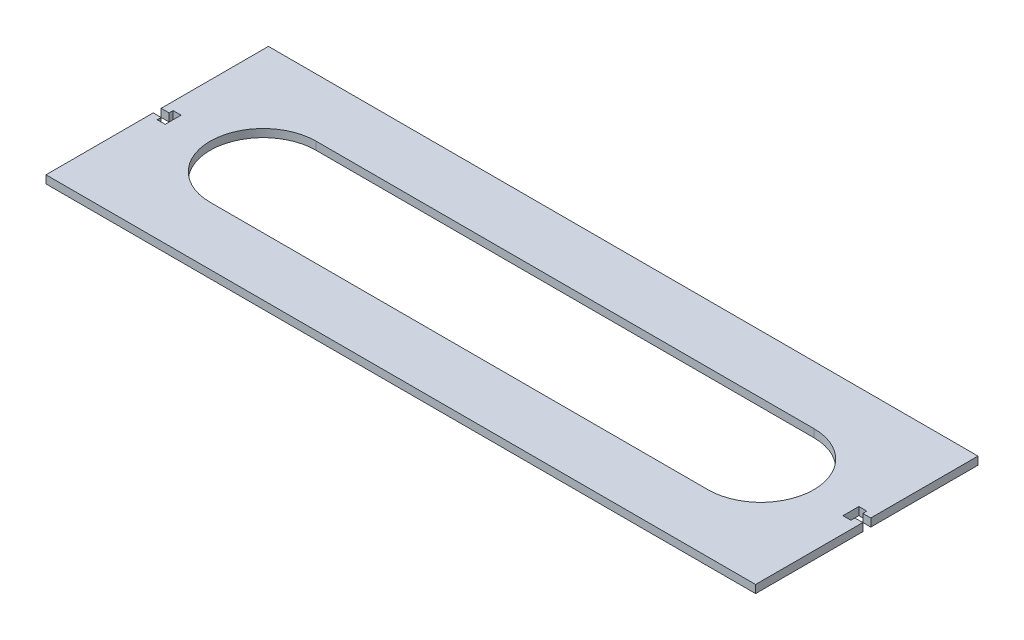
ISO-10303-21;
HEADER;
FILE_DESCRIPTION(('STEP AP214'),'2;1');
FILE_NAME('part.step','',(''),(''),'','','');
FILE_SCHEMA(('AUTOMOTIVE_DESIGN { 1 0 10303 214 1 1 1 1 }'));
ENDSEC;
DATA;
#1=APPLICATION_CONTEXT('core data for automotive mechanical design processes');
#2=APPLICATION_PROTOCOL_DEFINITION('international standard','automotive_design',2000,#1);
#3=PRODUCT_CONTEXT('',#1,'mechanical');
#4=PRODUCT('Part','Part','',(#3));
#5=PRODUCT_RELATED_PRODUCT_CATEGORY('part','',(#4));
#6=PRODUCT_DEFINITION_FORMATION('','',#4);
#7=PRODUCT_DEFINITION_CONTEXT('part definition',#1,'design');
#8=PRODUCT_DEFINITION('design','',#6,#7);
#9=PRODUCT_DEFINITION_SHAPE('','',#8);
#10=(LENGTH_UNIT() NAMED_UNIT(*) SI_UNIT(.MILLI.,.METRE.));
#11=(NAMED_UNIT(*) PLANE_ANGLE_UNIT() SI_UNIT($,.RADIAN.));
#12=(NAMED_UNIT(*) SI_UNIT($,.STERADIAN.) SOLID_ANGLE_UNIT());
#13=UNCERTAINTY_MEASURE_WITH_UNIT(LENGTH_MEASURE(1.E-05),#10,'distance_accuracy_value','');
#14=(GEOMETRIC_REPRESENTATION_CONTEXT(3) GLOBAL_UNCERTAINTY_ASSIGNED_CONTEXT((#13)) GLOBAL_UNIT_ASSIGNED_CONTEXT((#10,
#11,#12)) REPRESENTATION_CONTEXT('',''));
#15=CARTESIAN_POINT('',(0.,0.,0.));
#16=DIRECTION('',(0.,0.,1.));
#17=DIRECTION('',(1.,0.,0.));
#18=AXIS2_PLACEMENT_3D('',#15,#16,#17);
#19=CARTESIAN_POINT('',(0.,3.,0.));
#20=DIRECTION('',(0.,1.,0.));
#21=DIRECTION('',(0.,0.,1.));
#22=AXIS2_PLACEMENT_3D('',#19,#20,#21);
#23=PLANE('',#22);
#24=DIRECTION('',(0.,0.,1.));
#25=VECTOR('',#24,1.);
#26=CARTESIAN_POINT('',(-134.,3.,-1.5));
#27=LINE('',#26,#25);
#28=CARTESIAN_POINT('',(-134.,3.,-42.));
#29=VERTEX_POINT('',#28);
#30=CARTESIAN_POINT('',(-134.,3.,-1.5));
#31=VERTEX_POINT('',#30);
#32=EDGE_CURVE('E236',#29,#31,#27,.T.);
#33=ORIENTED_EDGE('',*,*,#32,.T.);
#34=DIRECTION('',(1.,0.,0.));
#35=VECTOR('',#34,1.);
#36=CARTESIAN_POINT('',(-134.,3.,-1.5));
#37=LINE('',#36,#35);
#38=CARTESIAN_POINT('',(-131.,3.,-1.5));
#39=VERTEX_POINT('',#38);
#40=EDGE_CURVE('E239',#31,#39,#37,.T.);
#41=ORIENTED_EDGE('',*,*,#40,.T.);
#42=DIRECTION('',(0.,0.,-1.));
#43=VECTOR('',#42,1.);
#44=CARTESIAN_POINT('',(-131.,3.,-1.5));
#45=LINE('',#44,#43);
#46=CARTESIAN_POINT('',(-131.,3.,-3.));
#47=VERTEX_POINT('',#46);
#48=EDGE_CURVE('E242',#39,#47,#45,.T.);
#49=ORIENTED_EDGE('',*,*,#48,.T.);
#50=DIRECTION('',(1.,0.,0.));
#51=VECTOR('',#50,1.);
#52=CARTESIAN_POINT('',(-131.,3.,-3.));
#53=LINE('',#52,#51);
#54=CARTESIAN_POINT('',(-128.,3.,-3.));
#55=VERTEX_POINT('',#54);
#56=EDGE_CURVE('E244',#47,#55,#53,.T.);
#57=ORIENTED_EDGE('',*,*,#56,.T.);
#58=DIRECTION('',(0.,0.,1.));
#59=VECTOR('',#58,1.);
#60=CARTESIAN_POINT('',(-128.,3.,-3.));
#61=LINE('',#60,#59);
#62=CARTESIAN_POINT('',(-128.,3.,3.));
#63=VERTEX_POINT('',#62);
#64=EDGE_CURVE('E246',#55,#63,#61,.T.);
#65=ORIENTED_EDGE('',*,*,#64,.T.);
#66=DIRECTION('',(-1.,0.,0.));
#67=VECTOR('',#66,1.);
#68=CARTESIAN_POINT('',(-131.,3.,3.00000000000006));
#69=LINE('',#68,#67);
#70=CARTESIAN_POINT('',(-131.,3.,3.00000000000006));
#71=VERTEX_POINT('',#70);
#72=EDGE_CURVE('E248',#63,#71,#69,.T.);
#73=ORIENTED_EDGE('',*,*,#72,.T.);
#74=DIRECTION('',(0.,0.,-1.));
#75=VECTOR('',#74,1.);
#76=CARTESIAN_POINT('',(-131.,3.,1.50000000000006));
#77=LINE('',#76,#75);
#78=CARTESIAN_POINT('',(-131.,3.,1.50000000000006));
#79=VERTEX_POINT('',#78);
#80=EDGE_CURVE('E250',#71,#79,#77,.T.);
#81=ORIENTED_EDGE('',*,*,#80,.T.);
#82=DIRECTION('',(-1.,0.,0.));
#83=VECTOR('',#82,1.);
#84=CARTESIAN_POINT('',(-134.,3.,1.50000000000011));
#85=LINE('',#84,#83);
#86=CARTESIAN_POINT('',(-134.,3.,1.50000000000011));
#87=VERTEX_POINT('',#86);
#88=EDGE_CURVE('E252',#79,#87,#85,.T.);
#89=ORIENTED_EDGE('',*,*,#88,.T.);
#90=DIRECTION('',(0.,0.,1.));
#91=VECTOR('',#90,1.);
#92=CARTESIAN_POINT('',(-134.,3.,42.));
#93=LINE('',#92,#91);
#94=CARTESIAN_POINT('',(-134.,3.,42.));
#95=VERTEX_POINT('',#94);
#96=EDGE_CURVE('E254',#87,#95,#93,.T.);
#97=ORIENTED_EDGE('',*,*,#96,.T.);
#98=DIRECTION('',(1.,0.,0.));
#99=VECTOR('',#98,1.);
#100=CARTESIAN_POINT('',(134.,3.,42.));
#101=LINE('',#100,#99);
#102=CARTESIAN_POINT('',(134.,3.,42.));
#103=VERTEX_POINT('',#102);
#104=EDGE_CURVE('E256',#95,#103,#101,.T.);
#105=ORIENTED_EDGE('',*,*,#104,.T.);
#106=DIRECTION('',(0.,0.,-1.));
#107=VECTOR('',#106,1.);
#108=CARTESIAN_POINT('',(134.,3.,42.));
#109=LINE('',#108,#107);
#110=CARTESIAN_POINT('',(134.,3.,1.50000000000064));
#111=VERTEX_POINT('',#110);
#112=EDGE_CURVE('E258',#103,#111,#109,.T.);
#113=ORIENTED_EDGE('',*,*,#112,.T.);
#114=DIRECTION('',(-1.,0.,0.));
#115=VECTOR('',#114,1.);
#116=CARTESIAN_POINT('',(134.,3.,1.50000000000064));
#117=LINE('',#116,#115);
#118=CARTESIAN_POINT('',(131.,3.,1.50000000000058));
#119=VERTEX_POINT('',#118);
#120=EDGE_CURVE('E260',#111,#119,#117,.T.);
#121=ORIENTED_EDGE('',*,*,#120,.T.);
#122=DIRECTION('',(0.,0.,1.));
#123=VECTOR('',#122,1.);
#124=CARTESIAN_POINT('',(131.,3.,1.50000000000058));
#125=LINE('',#124,#123);
#126=CARTESIAN_POINT('',(131.,3.,3.00000000000058));
#127=VERTEX_POINT('',#126);
#128=EDGE_CURVE('E262',#119,#127,#125,.T.);
#129=ORIENTED_EDGE('',*,*,#128,.T.);
#130=DIRECTION('',(-1.,0.,0.));
#131=VECTOR('',#130,1.);
#132=CARTESIAN_POINT('',(131.,3.,3.00000000000058));
#133=LINE('',#132,#131);
#134=CARTESIAN_POINT('',(128.,3.,3.00000000000051));
#135=VERTEX_POINT('',#134);
#136=EDGE_CURVE('E264',#127,#135,#133,.T.);
#137=ORIENTED_EDGE('',*,*,#136,.T.);
#138=DIRECTION('',(0.,0.,-1.));
#139=VECTOR('',#138,1.);
#140=CARTESIAN_POINT('',(128.,3.,-2.99999999999949));
#141=LINE('',#140,#139);
#142=CARTESIAN_POINT('',(128.,3.,-2.99999999999949));
#143=VERTEX_POINT('',#142);
#144=EDGE_CURVE('E266',#135,#143,#141,.T.);
#145=ORIENTED_EDGE('',*,*,#144,.T.);
#146=DIRECTION('',(1.,0.,0.));
#147=VECTOR('',#146,1.);
#148=CARTESIAN_POINT('',(131.,3.,-2.99999999999948));
#149=LINE('',#148,#147);
#150=CARTESIAN_POINT('',(131.,3.,-2.99999999999948));
#151=VERTEX_POINT('',#150);
#152=EDGE_CURVE('E268',#143,#151,#149,.T.);
#153=ORIENTED_EDGE('',*,*,#152,.T.);
#154=DIRECTION('',(0.,0.,1.));
#155=VECTOR('',#154,1.);
#156=CARTESIAN_POINT('',(131.,3.,-1.49999999999948));
#157=LINE('',#156,#155);
#158=CARTESIAN_POINT('',(131.,3.,-1.49999999999948));
#159=VERTEX_POINT('',#158);
#160=EDGE_CURVE('E270',#151,#159,#157,.T.);
#161=ORIENTED_EDGE('',*,*,#160,.T.);
#162=DIRECTION('',(1.,0.,0.));
#163=VECTOR('',#162,1.);
#164=CARTESIAN_POINT('',(134.,3.,-1.49999999999947));
#165=LINE('',#164,#163);
#166=CARTESIAN_POINT('',(134.,3.,-1.49999999999947));
#167=VERTEX_POINT('',#166);
#168=EDGE_CURVE('E272',#159,#167,#165,.T.);
#169=ORIENTED_EDGE('',*,*,#168,.T.);
#170=DIRECTION('',(0.,0.,-1.));
#171=VECTOR('',#170,1.);
#172=CARTESIAN_POINT('',(134.,3.,-1.49999999999947));
#173=LINE('',#172,#171);
#174=CARTESIAN_POINT('',(134.,3.,-42.));
#175=VERTEX_POINT('',#174);
#176=EDGE_CURVE('E274',#167,#175,#173,.T.);
#177=ORIENTED_EDGE('',*,*,#176,.T.);
#178=DIRECTION('',(-1.,0.,0.));
#179=VECTOR('',#178,1.);
#180=CARTESIAN_POINT('',(134.,3.,-42.));
#181=LINE('',#180,#179);
#182=EDGE_CURVE('E276',#175,#29,#181,.T.);
#183=ORIENTED_EDGE('',*,*,#182,.T.);
#184=EDGE_LOOP('',(#33,#41,#49,#57,#65,#73,#81,#89,#97,#105,#113,#121,#129,#137,#145,#153,#161,
#169,#177,#183));
#185=FACE_BOUND('',#184,.T.);
#186=DIRECTION('',(-1.,0.,0.));
#187=VECTOR('',#186,1.);
#188=CARTESIAN_POINT('',(94.,3.,-20.));
#189=LINE('',#188,#187);
#190=CARTESIAN_POINT('',(94.,3.,-20.));
#191=VERTEX_POINT('',#190);
#192=CARTESIAN_POINT('',(-94.0000000000001,3.,-20.));
#193=VERTEX_POINT('',#192);
#194=EDGE_CURVE('E208',#191,#193,#189,.T.);
#195=ORIENTED_EDGE('',*,*,#194,.F.);
#196=CARTESIAN_POINT('',(93.9999999999999,3.,0.));
#197=DIRECTION('',(0.,1.,0.));
#198=DIRECTION('',(0.,0.,1.));
#199=AXIS2_PLACEMENT_3D('',#196,#197,#198);
#200=CIRCLE('',#199,20.);
#201=CARTESIAN_POINT('',(94.,3.,20.));
#202=VERTEX_POINT('',#201);
#203=EDGE_CURVE('E200',#202,#191,#200,.T.);
#204=ORIENTED_EDGE('',*,*,#203,.F.);
#205=DIRECTION('',(1.,0.,0.));
#206=VECTOR('',#205,1.);
#207=CARTESIAN_POINT('',(94.,3.,20.));
#208=LINE('',#207,#206);
#209=CARTESIAN_POINT('',(-94.0000000000001,3.,20.));
#210=VERTEX_POINT('',#209);
#211=EDGE_CURVE('E222',#210,#202,#208,.T.);
#212=ORIENTED_EDGE('',*,*,#211,.F.);
#213=CARTESIAN_POINT('',(-94.0000000000001,3.,0.));
#214=DIRECTION('',(0.,1.,0.));
#215=DIRECTION('',(0.,0.,1.));
#216=AXIS2_PLACEMENT_3D('',#213,#214,#215);
#217=CIRCLE('',#216,20.);
#218=EDGE_CURVE('E220',#193,#210,#217,.T.);
#219=ORIENTED_EDGE('',*,*,#218,.F.);
#220=EDGE_LOOP('',(#195,#204,#212,#219));
#221=FACE_BOUND('',#220,.T.);
#222=ADVANCED_FACE('F39',(#185,#221),#23,.T.);
#223=CARTESIAN_POINT('',(0.,0.,0.));
#224=DIRECTION('',(0.,1.,0.));
#225=DIRECTION('',(0.,0.,1.));
#226=AXIS2_PLACEMENT_3D('',#223,#224,#225);
#227=PLANE('',#226);
#228=DIRECTION('',(0.,0.,1.));
#229=VECTOR('',#228,1.);
#230=CARTESIAN_POINT('',(-134.,0.,-1.5));
#231=LINE('',#230,#229);
#232=CARTESIAN_POINT('',(-134.,0.,-42.));
#233=VERTEX_POINT('',#232);
#234=CARTESIAN_POINT('',(-134.,0.,-1.5));
#235=VERTEX_POINT('',#234);
#236=EDGE_CURVE('E216',#233,#235,#231,.T.);
#237=ORIENTED_EDGE('',*,*,#236,.F.);
#238=DIRECTION('',(-1.,0.,0.));
#239=VECTOR('',#238,1.);
#240=CARTESIAN_POINT('',(134.,0.,-42.));
#241=LINE('',#240,#239);
#242=CARTESIAN_POINT('',(134.,0.,-42.));
#243=VERTEX_POINT('',#242);
#244=EDGE_CURVE('E240',#243,#233,#241,.T.);
#245=ORIENTED_EDGE('',*,*,#244,.F.);
#246=DIRECTION('',(0.,0.,-1.));
#247=VECTOR('',#246,1.);
#248=CARTESIAN_POINT('',(134.,0.,-1.49999999999947));
#249=LINE('',#248,#247);
#250=CARTESIAN_POINT('',(134.,0.,-1.49999999999947));
#251=VERTEX_POINT('',#250);
#252=EDGE_CURVE('E315',#251,#243,#249,.T.);
#253=ORIENTED_EDGE('',*,*,#252,.F.);
#254=DIRECTION('',(1.,0.,0.));
#255=VECTOR('',#254,1.);
#256=CARTESIAN_POINT('',(134.,0.,-1.49999999999947));
#257=LINE('',#256,#255);
#258=CARTESIAN_POINT('',(131.,0.,-1.49999999999948));
#259=VERTEX_POINT('',#258);
#260=EDGE_CURVE('E313',#259,#251,#257,.T.);
#261=ORIENTED_EDGE('',*,*,#260,.F.);
#262=DIRECTION('',(0.,0.,1.));
#263=VECTOR('',#262,1.);
#264=CARTESIAN_POINT('',(131.,0.,-1.49999999999948));
#265=LINE('',#264,#263);
#266=CARTESIAN_POINT('',(131.,0.,-2.99999999999948));
#267=VERTEX_POINT('',#266);
#268=EDGE_CURVE('E311',#267,#259,#265,.T.);
#269=ORIENTED_EDGE('',*,*,#268,.F.);
#270=DIRECTION('',(1.,0.,0.));
#271=VECTOR('',#270,1.);
#272=CARTESIAN_POINT('',(131.,0.,-2.99999999999948));
#273=LINE('',#272,#271);
#274=CARTESIAN_POINT('',(128.,0.,-2.99999999999949));
#275=VERTEX_POINT('',#274);
#276=EDGE_CURVE('E309',#275,#267,#273,.T.);
#277=ORIENTED_EDGE('',*,*,#276,.F.);
#278=DIRECTION('',(0.,0.,-1.));
#279=VECTOR('',#278,1.);
#280=CARTESIAN_POINT('',(128.,0.,-2.99999999999949));
#281=LINE('',#280,#279);
#282=CARTESIAN_POINT('',(128.,0.,3.00000000000051));
#283=VERTEX_POINT('',#282);
#284=EDGE_CURVE('E307',#283,#275,#281,.T.);
#285=ORIENTED_EDGE('',*,*,#284,.F.);
#286=DIRECTION('',(-1.,0.,0.));
#287=VECTOR('',#286,1.);
#288=CARTESIAN_POINT('',(131.,0.,3.00000000000058));
#289=LINE('',#288,#287);
#290=CARTESIAN_POINT('',(131.,0.,3.00000000000058));
#291=VERTEX_POINT('',#290);
#292=EDGE_CURVE('E305',#291,#283,#289,.T.);
#293=ORIENTED_EDGE('',*,*,#292,.F.);
#294=DIRECTION('',(0.,0.,1.));
#295=VECTOR('',#294,1.);
#296=CARTESIAN_POINT('',(131.,0.,1.50000000000058));
#297=LINE('',#296,#295);
#298=CARTESIAN_POINT('',(131.,0.,1.50000000000058));
#299=VERTEX_POINT('',#298);
#300=EDGE_CURVE('E303',#299,#291,#297,.T.);
#301=ORIENTED_EDGE('',*,*,#300,.F.);
#302=DIRECTION('',(-1.,0.,0.));
#303=VECTOR('',#302,1.);
#304=CARTESIAN_POINT('',(134.,0.,1.50000000000064));
#305=LINE('',#304,#303);
#306=CARTESIAN_POINT('',(134.,0.,1.50000000000064));
#307=VERTEX_POINT('',#306);
#308=EDGE_CURVE('E301',#307,#299,#305,.T.);
#309=ORIENTED_EDGE('',*,*,#308,.F.);
#310=DIRECTION('',(0.,0.,-1.));
#311=VECTOR('',#310,1.);
#312=CARTESIAN_POINT('',(134.,0.,42.));
#313=LINE('',#312,#311);
#314=CARTESIAN_POINT('',(134.,0.,42.));
#315=VERTEX_POINT('',#314);
#316=EDGE_CURVE('E299',#315,#307,#313,.T.);
#317=ORIENTED_EDGE('',*,*,#316,.F.);
#318=DIRECTION('',(1.,0.,0.));
#319=VECTOR('',#318,1.);
#320=CARTESIAN_POINT('',(134.,0.,42.));
#321=LINE('',#320,#319);
#322=CARTESIAN_POINT('',(-134.,0.,42.));
#323=VERTEX_POINT('',#322);
#324=EDGE_CURVE('E297',#323,#315,#321,.T.);
#325=ORIENTED_EDGE('',*,*,#324,.F.);
#326=DIRECTION('',(0.,0.,1.));
#327=VECTOR('',#326,1.);
#328=CARTESIAN_POINT('',(-134.,0.,42.));
#329=LINE('',#328,#327);
#330=CARTESIAN_POINT('',(-134.,0.,1.50000000000011));
#331=VERTEX_POINT('',#330);
#332=EDGE_CURVE('E295',#331,#323,#329,.T.);
#333=ORIENTED_EDGE('',*,*,#332,.F.);
#334=DIRECTION('',(-1.,0.,0.));
#335=VECTOR('',#334,1.);
#336=CARTESIAN_POINT('',(-134.,0.,1.50000000000011));
#337=LINE('',#336,#335);
#338=CARTESIAN_POINT('',(-131.,0.,1.50000000000006));
#339=VERTEX_POINT('',#338);
#340=EDGE_CURVE('E293',#339,#331,#337,.T.);
#341=ORIENTED_EDGE('',*,*,#340,.F.);
#342=DIRECTION('',(0.,0.,-1.));
#343=VECTOR('',#342,1.);
#344=CARTESIAN_POINT('',(-131.,0.,1.50000000000006));
#345=LINE('',#344,#343);
#346=CARTESIAN_POINT('',(-131.,0.,3.00000000000006));
#347=VERTEX_POINT('',#346);
#348=EDGE_CURVE('E291',#347,#339,#345,.T.);
#349=ORIENTED_EDGE('',*,*,#348,.F.);
#350=DIRECTION('',(-1.,0.,0.));
#351=VECTOR('',#350,1.);
#352=CARTESIAN_POINT('',(-131.,0.,3.00000000000006));
#353=LINE('',#352,#351);
#354=CARTESIAN_POINT('',(-128.,0.,3.));
#355=VERTEX_POINT('',#354);
#356=EDGE_CURVE('E289',#355,#347,#353,.T.);
#357=ORIENTED_EDGE('',*,*,#356,.F.);
#358=DIRECTION('',(0.,0.,1.));
#359=VECTOR('',#358,1.);
#360=CARTESIAN_POINT('',(-128.,0.,-3.));
#361=LINE('',#360,#359);
#362=CARTESIAN_POINT('',(-128.,0.,-3.));
#363=VERTEX_POINT('',#362);
#364=EDGE_CURVE('E287',#363,#355,#361,.T.);
#365=ORIENTED_EDGE('',*,*,#364,.F.);
#366=DIRECTION('',(1.,0.,0.));
#367=VECTOR('',#366,1.);
#368=CARTESIAN_POINT('',(-131.,0.,-3.));
#369=LINE('',#368,#367);
#370=CARTESIAN_POINT('',(-131.,0.,-3.));
#371=VERTEX_POINT('',#370);
#372=EDGE_CURVE('E285',#371,#363,#369,.T.);
#373=ORIENTED_EDGE('',*,*,#372,.F.);
#374=DIRECTION('',(0.,0.,-1.));
#375=VECTOR('',#374,1.);
#376=CARTESIAN_POINT('',(-131.,0.,-1.5));
#377=LINE('',#376,#375);
#378=CARTESIAN_POINT('',(-131.,0.,-1.5));
#379=VERTEX_POINT('',#378);
#380=EDGE_CURVE('E283',#379,#371,#377,.T.);
#381=ORIENTED_EDGE('',*,*,#380,.F.);
#382=DIRECTION('',(1.,0.,0.));
#383=VECTOR('',#382,1.);
#384=CARTESIAN_POINT('',(-134.,0.,-1.5));
#385=LINE('',#384,#383);
#386=EDGE_CURVE('E281',#235,#379,#385,.T.);
#387=ORIENTED_EDGE('',*,*,#386,.F.);
#388=EDGE_LOOP('',(#237,#245,#253,#261,#269,#277,#285,#293,#301,#309,#317,#325,#333,#341,#349,
#357,#365,#373,#381,#387));
#389=FACE_BOUND('',#388,.T.);
#390=CARTESIAN_POINT('',(93.9999999999999,0.,0.));
#391=DIRECTION('',(0.,1.,0.));
#392=DIRECTION('',(0.,0.,1.));
#393=AXIS2_PLACEMENT_3D('',#390,#391,#392);
#394=CIRCLE('',#393,20.);
#395=CARTESIAN_POINT('',(94.,0.,20.));
#396=VERTEX_POINT('',#395);
#397=CARTESIAN_POINT('',(94.,0.,-20.));
#398=VERTEX_POINT('',#397);
#399=EDGE_CURVE('E62',#396,#398,#394,.T.);
#400=ORIENTED_EDGE('',*,*,#399,.T.);
#401=DIRECTION('',(-1.,0.,0.));
#402=VECTOR('',#401,1.);
#403=CARTESIAN_POINT('',(94.,0.,-20.));
#404=LINE('',#403,#402);
#405=CARTESIAN_POINT('',(-94.0000000000001,0.,-20.));
#406=VERTEX_POINT('',#405);
#407=EDGE_CURVE('E215',#398,#406,#404,.T.);
#408=ORIENTED_EDGE('',*,*,#407,.T.);
#409=CARTESIAN_POINT('',(-94.0000000000001,0.,0.));
#410=DIRECTION('',(0.,1.,0.));
#411=DIRECTION('',(0.,0.,1.));
#412=AXIS2_PLACEMENT_3D('',#409,#410,#411);
#413=CIRCLE('',#412,20.);
#414=CARTESIAN_POINT('',(-94.0000000000001,0.,20.));
#415=VERTEX_POINT('',#414);
#416=EDGE_CURVE('E228',#406,#415,#413,.T.);
#417=ORIENTED_EDGE('',*,*,#416,.T.);
#418=DIRECTION('',(1.,0.,0.));
#419=VECTOR('',#418,1.);
#420=CARTESIAN_POINT('',(94.,0.,20.));
#421=LINE('',#420,#419);
#422=EDGE_CURVE('E209',#415,#396,#421,.T.);
#423=ORIENTED_EDGE('',*,*,#422,.T.);
#424=EDGE_LOOP('',(#400,#408,#417,#423));
#425=FACE_BOUND('',#424,.T.);
#426=ADVANCED_FACE('F381',(#389,#425),#227,.F.);
#427=CARTESIAN_POINT('',(-134.,3.,-1.5));
#428=DIRECTION('',(1.,0.,0.));
#429=DIRECTION('',(0.,0.,-1.));
#430=AXIS2_PLACEMENT_3D('',#427,#428,#429);
#431=PLANE('',#430);
#432=ORIENTED_EDGE('',*,*,#236,.T.);
#433=DIRECTION('',(0.,-1.,0.));
#434=VECTOR('',#433,1.);
#435=CARTESIAN_POINT('',(-134.,3.,-1.5));
#436=LINE('',#435,#434);
#437=EDGE_CURVE('E11',#31,#235,#436,.T.);
#438=ORIENTED_EDGE('',*,*,#437,.F.);
#439=ORIENTED_EDGE('',*,*,#32,.F.);
#440=DIRECTION('',(0.,-1.,0.));
#441=VECTOR('',#440,1.);
#442=CARTESIAN_POINT('',(-134.,3.,-42.));
#443=LINE('',#442,#441);
#444=EDGE_CURVE('E278',#29,#233,#443,.T.);
#445=ORIENTED_EDGE('',*,*,#444,.T.);
#446=EDGE_LOOP('',(#432,#438,#439,#445));
#447=FACE_BOUND('',#446,.T.);
#448=ADVANCED_FACE('F41',(#447),#431,.F.);
#449=CARTESIAN_POINT('',(-134.,3.,-1.5));
#450=DIRECTION('',(0.,0.,-1.));
#451=DIRECTION('',(-1.,0.,0.));
#452=AXIS2_PLACEMENT_3D('',#449,#450,#451);
#453=PLANE('',#452);
#454=ORIENTED_EDGE('',*,*,#386,.T.);
#455=DIRECTION('',(0.,-1.,0.));
#456=VECTOR('',#455,1.);
#457=CARTESIAN_POINT('',(-131.,3.,-1.5));
#458=LINE('',#457,#456);
#459=EDGE_CURVE('E47',#39,#379,#458,.T.);
#460=ORIENTED_EDGE('',*,*,#459,.F.);
#461=ORIENTED_EDGE('',*,*,#40,.F.);
#462=ORIENTED_EDGE('',*,*,#437,.T.);
#463=EDGE_LOOP('',(#454,#460,#461,#462));
#464=FACE_BOUND('',#463,.T.);
#465=ADVANCED_FACE('F398',(#464),#453,.F.);
#466=CARTESIAN_POINT('',(-131.,3.,-1.5));
#467=DIRECTION('',(-1.,0.,0.));
#468=DIRECTION('',(0.,0.,1.));
#469=AXIS2_PLACEMENT_3D('',#466,#467,#468);
#470=PLANE('',#469);
#471=ORIENTED_EDGE('',*,*,#380,.T.);
#472=DIRECTION('',(0.,-1.,0.));
#473=VECTOR('',#472,1.);
#474=CARTESIAN_POINT('',(-131.,3.,-3.));
#475=LINE('',#474,#473);
#476=EDGE_CURVE('E368',#47,#371,#475,.T.);
#477=ORIENTED_EDGE('',*,*,#476,.F.);
#478=ORIENTED_EDGE('',*,*,#48,.F.);
#479=ORIENTED_EDGE('',*,*,#459,.T.);
#480=EDGE_LOOP('',(#471,#477,#478,#479));
#481=FACE_BOUND('',#480,.T.);
#482=ADVANCED_FACE('F375',(#481),#470,.F.);
#483=CARTESIAN_POINT('',(-131.,3.,-3.));
#484=DIRECTION('',(0.,0.,-1.));
#485=DIRECTION('',(-1.,0.,0.));
#486=AXIS2_PLACEMENT_3D('',#483,#484,#485);
#487=PLANE('',#486);
#488=ORIENTED_EDGE('',*,*,#372,.T.);
#489=DIRECTION('',(0.,-1.,0.));
#490=VECTOR('',#489,1.);
#491=CARTESIAN_POINT('',(-128.,3.,-3.));
#492=LINE('',#491,#490);
#493=EDGE_CURVE('E365',#55,#363,#492,.T.);
#494=ORIENTED_EDGE('',*,*,#493,.F.);
#495=ORIENTED_EDGE('',*,*,#56,.F.);
#496=ORIENTED_EDGE('',*,*,#476,.T.);
#497=EDGE_LOOP('',(#488,#494,#495,#496));
#498=FACE_BOUND('',#497,.T.);
#499=ADVANCED_FACE('F387',(#498),#487,.F.);
#500=CARTESIAN_POINT('',(-128.,3.,-3.));
#501=DIRECTION('',(1.,0.,0.));
#502=DIRECTION('',(0.,0.,-1.));
#503=AXIS2_PLACEMENT_3D('',#500,#501,#502);
#504=PLANE('',#503);
#505=ORIENTED_EDGE('',*,*,#364,.T.);
#506=DIRECTION('',(0.,-1.,0.));
#507=VECTOR('',#506,1.);
#508=CARTESIAN_POINT('',(-128.,3.,3.));
#509=LINE('',#508,#507);
#510=EDGE_CURVE('E362',#63,#355,#509,.T.);
#511=ORIENTED_EDGE('',*,*,#510,.F.);
#512=ORIENTED_EDGE('',*,*,#64,.F.);
#513=ORIENTED_EDGE('',*,*,#493,.T.);
#514=EDGE_LOOP('',(#505,#511,#512,#513));
#515=FACE_BOUND('',#514,.T.);
#516=ADVANCED_FACE('F391',(#515),#504,.F.);
#517=CARTESIAN_POINT('',(-131.,3.,3.00000000000006));
#518=DIRECTION('',(0.,0.,1.));
#519=DIRECTION('',(1.,0.,0.));
#520=AXIS2_PLACEMENT_3D('',#517,#518,#519);
#521=PLANE('',#520);
#522=ORIENTED_EDGE('',*,*,#356,.T.);
#523=DIRECTION('',(0.,-1.,0.));
#524=VECTOR('',#523,1.);
#525=CARTESIAN_POINT('',(-131.,3.,3.00000000000006));
#526=LINE('',#525,#524);
#527=EDGE_CURVE('E359',#71,#347,#526,.T.);
#528=ORIENTED_EDGE('',*,*,#527,.F.);
#529=ORIENTED_EDGE('',*,*,#72,.F.);
#530=ORIENTED_EDGE('',*,*,#510,.T.);
#531=EDGE_LOOP('',(#522,#528,#529,#530));
#532=FACE_BOUND('',#531,.T.);
#533=ADVANCED_FACE('F471',(#532),#521,.F.);
#534=CARTESIAN_POINT('',(-131.,3.,1.50000000000006));
#535=DIRECTION('',(-1.,0.,0.));
#536=DIRECTION('',(0.,0.,1.));
#537=AXIS2_PLACEMENT_3D('',#534,#535,#536);
#538=PLANE('',#537);
#539=ORIENTED_EDGE('',*,*,#348,.T.);
#540=DIRECTION('',(0.,-1.,0.));
#541=VECTOR('',#540,1.);
#542=CARTESIAN_POINT('',(-131.,3.,1.50000000000006));
#543=LINE('',#542,#541);
#544=EDGE_CURVE('E356',#79,#339,#543,.T.);
#545=ORIENTED_EDGE('',*,*,#544,.F.);
#546=ORIENTED_EDGE('',*,*,#80,.F.);
#547=ORIENTED_EDGE('',*,*,#527,.T.);
#548=EDGE_LOOP('',(#539,#545,#546,#547));
#549=FACE_BOUND('',#548,.T.);
#550=ADVANCED_FACE('F469',(#549),#538,.F.);
#551=CARTESIAN_POINT('',(-134.,3.,1.50000000000011));
#552=DIRECTION('',(0.,0.,1.));
#553=DIRECTION('',(1.,0.,0.));
#554=AXIS2_PLACEMENT_3D('',#551,#552,#553);
#555=PLANE('',#554);
#556=ORIENTED_EDGE('',*,*,#340,.T.);
#557=DIRECTION('',(0.,-1.,0.));
#558=VECTOR('',#557,1.);
#559=CARTESIAN_POINT('',(-134.,3.,1.50000000000011));
#560=LINE('',#559,#558);
#561=EDGE_CURVE('E353',#87,#331,#560,.T.);
#562=ORIENTED_EDGE('',*,*,#561,.F.);
#563=ORIENTED_EDGE('',*,*,#88,.F.);
#564=ORIENTED_EDGE('',*,*,#544,.T.);
#565=EDGE_LOOP('',(#556,#562,#563,#564));
#566=FACE_BOUND('',#565,.T.);
#567=ADVANCED_FACE('F464',(#566),#555,.F.);
#568=CARTESIAN_POINT('',(-134.,3.,42.));
#569=DIRECTION('',(1.,0.,0.));
#570=DIRECTION('',(0.,0.,-1.));
#571=AXIS2_PLACEMENT_3D('',#568,#569,#570);
#572=PLANE('',#571);
#573=ORIENTED_EDGE('',*,*,#332,.T.);
#574=DIRECTION('',(0.,-1.,0.));
#575=VECTOR('',#574,1.);
#576=CARTESIAN_POINT('',(-134.,3.,42.));
#577=LINE('',#576,#575);
#578=EDGE_CURVE('E350',#95,#323,#577,.T.);
#579=ORIENTED_EDGE('',*,*,#578,.F.);
#580=ORIENTED_EDGE('',*,*,#96,.F.);
#581=ORIENTED_EDGE('',*,*,#561,.T.);
#582=EDGE_LOOP('',(#573,#579,#580,#581));
#583=FACE_BOUND('',#582,.T.);
#584=ADVANCED_FACE('F459',(#583),#572,.F.);
#585=CARTESIAN_POINT('',(134.,3.,42.));
#586=DIRECTION('',(0.,0.,-1.));
#587=DIRECTION('',(-1.,0.,0.));
#588=AXIS2_PLACEMENT_3D('',#585,#586,#587);
#589=PLANE('',#588);
#590=ORIENTED_EDGE('',*,*,#324,.T.);
#591=DIRECTION('',(0.,-1.,0.));
#592=VECTOR('',#591,1.);
#593=CARTESIAN_POINT('',(134.,3.,42.));
#594=LINE('',#593,#592);
#595=EDGE_CURVE('E347',#103,#315,#594,.T.);
#596=ORIENTED_EDGE('',*,*,#595,.F.);
#597=ORIENTED_EDGE('',*,*,#104,.F.);
#598=ORIENTED_EDGE('',*,*,#578,.T.);
#599=EDGE_LOOP('',(#590,#596,#597,#598));
#600=FACE_BOUND('',#599,.T.);
#601=ADVANCED_FACE('F455',(#600),#589,.F.);
#602=CARTESIAN_POINT('',(134.,3.,42.));
#603=DIRECTION('',(-1.,0.,0.));
#604=DIRECTION('',(0.,0.,1.));
#605=AXIS2_PLACEMENT_3D('',#602,#603,#604);
#606=PLANE('',#605);
#607=ORIENTED_EDGE('',*,*,#316,.T.);
#608=DIRECTION('',(0.,-1.,0.));
#609=VECTOR('',#608,1.);
#610=CARTESIAN_POINT('',(134.,3.,1.50000000000064));
#611=LINE('',#610,#609);
#612=EDGE_CURVE('E344',#111,#307,#611,.T.);
#613=ORIENTED_EDGE('',*,*,#612,.F.);
#614=ORIENTED_EDGE('',*,*,#112,.F.);
#615=ORIENTED_EDGE('',*,*,#595,.T.);
#616=EDGE_LOOP('',(#607,#613,#614,#615));
#617=FACE_BOUND('',#616,.T.);
#618=ADVANCED_FACE('F450',(#617),#606,.F.);
#619=CARTESIAN_POINT('',(134.,3.,1.50000000000064));
#620=DIRECTION('',(0.,0.,1.));
#621=DIRECTION('',(1.,0.,0.));
#622=AXIS2_PLACEMENT_3D('',#619,#620,#621);
#623=PLANE('',#622);
#624=ORIENTED_EDGE('',*,*,#308,.T.);
#625=DIRECTION('',(0.,-1.,0.));
#626=VECTOR('',#625,1.);
#627=CARTESIAN_POINT('',(131.,3.,1.50000000000058));
#628=LINE('',#627,#626);
#629=EDGE_CURVE('E341',#119,#299,#628,.T.);
#630=ORIENTED_EDGE('',*,*,#629,.F.);
#631=ORIENTED_EDGE('',*,*,#120,.F.);
#632=ORIENTED_EDGE('',*,*,#612,.T.);
#633=EDGE_LOOP('',(#624,#630,#631,#632));
#634=FACE_BOUND('',#633,.T.);
#635=ADVANCED_FACE('F444',(#634),#623,.F.);
#636=CARTESIAN_POINT('',(131.,3.,1.50000000000058));
#637=DIRECTION('',(1.,0.,0.));
#638=DIRECTION('',(0.,0.,-1.));
#639=AXIS2_PLACEMENT_3D('',#636,#637,#638);
#640=PLANE('',#639);
#641=ORIENTED_EDGE('',*,*,#300,.T.);
#642=DIRECTION('',(0.,-1.,0.));
#643=VECTOR('',#642,1.);
#644=CARTESIAN_POINT('',(131.,3.,3.00000000000058));
#645=LINE('',#644,#643);
#646=EDGE_CURVE('E338',#127,#291,#645,.T.);
#647=ORIENTED_EDGE('',*,*,#646,.F.);
#648=ORIENTED_EDGE('',*,*,#128,.F.);
#649=ORIENTED_EDGE('',*,*,#629,.T.);
#650=EDGE_LOOP('',(#641,#647,#648,#649));
#651=FACE_BOUND('',#650,.T.);
#652=ADVANCED_FACE('F440',(#651),#640,.F.);
#653=CARTESIAN_POINT('',(131.,3.,3.00000000000058));
#654=DIRECTION('',(0.,0.,1.));
#655=DIRECTION('',(1.,0.,0.));
#656=AXIS2_PLACEMENT_3D('',#653,#654,#655);
#657=PLANE('',#656);
#658=ORIENTED_EDGE('',*,*,#292,.T.);
#659=DIRECTION('',(0.,-1.,0.));
#660=VECTOR('',#659,1.);
#661=CARTESIAN_POINT('',(128.,3.,3.00000000000051));
#662=LINE('',#661,#660);
#663=EDGE_CURVE('E335',#135,#283,#662,.T.);
#664=ORIENTED_EDGE('',*,*,#663,.F.);
#665=ORIENTED_EDGE('',*,*,#136,.F.);
#666=ORIENTED_EDGE('',*,*,#646,.T.);
#667=EDGE_LOOP('',(#658,#664,#665,#666));
#668=FACE_BOUND('',#667,.T.);
#669=ADVANCED_FACE('F435',(#668),#657,.F.);
#670=CARTESIAN_POINT('',(128.,3.,-2.99999999999949));
#671=DIRECTION('',(-1.,0.,0.));
#672=DIRECTION('',(0.,0.,1.));
#673=AXIS2_PLACEMENT_3D('',#670,#671,#672);
#674=PLANE('',#673);
#675=ORIENTED_EDGE('',*,*,#284,.T.);
#676=DIRECTION('',(0.,-1.,0.));
#677=VECTOR('',#676,1.);
#678=CARTESIAN_POINT('',(128.,3.,-2.99999999999949));
#679=LINE('',#678,#677);
#680=EDGE_CURVE('E332',#143,#275,#679,.T.);
#681=ORIENTED_EDGE('',*,*,#680,.F.);
#682=ORIENTED_EDGE('',*,*,#144,.F.);
#683=ORIENTED_EDGE('',*,*,#663,.T.);
#684=EDGE_LOOP('',(#675,#681,#682,#683));
#685=FACE_BOUND('',#684,.T.);
#686=ADVANCED_FACE('F429',(#685),#674,.F.);
#687=CARTESIAN_POINT('',(131.,3.,-2.99999999999948));
#688=DIRECTION('',(0.,0.,-1.));
#689=DIRECTION('',(-1.,0.,0.));
#690=AXIS2_PLACEMENT_3D('',#687,#688,#689);
#691=PLANE('',#690);
#692=ORIENTED_EDGE('',*,*,#276,.T.);
#693=DIRECTION('',(0.,-1.,0.));
#694=VECTOR('',#693,1.);
#695=CARTESIAN_POINT('',(131.,3.,-2.99999999999948));
#696=LINE('',#695,#694);
#697=EDGE_CURVE('E329',#151,#267,#696,.T.);
#698=ORIENTED_EDGE('',*,*,#697,.F.);
#699=ORIENTED_EDGE('',*,*,#152,.F.);
#700=ORIENTED_EDGE('',*,*,#680,.T.);
#701=EDGE_LOOP('',(#692,#698,#699,#700));
#702=FACE_BOUND('',#701,.T.);
#703=ADVANCED_FACE('F425',(#702),#691,.F.);
#704=CARTESIAN_POINT('',(131.,3.,-1.49999999999948));
#705=DIRECTION('',(1.,0.,0.));
#706=DIRECTION('',(0.,0.,-1.));
#707=AXIS2_PLACEMENT_3D('',#704,#705,#706);
#708=PLANE('',#707);
#709=ORIENTED_EDGE('',*,*,#268,.T.);
#710=DIRECTION('',(0.,-1.,0.));
#711=VECTOR('',#710,1.);
#712=CARTESIAN_POINT('',(131.,3.,-1.49999999999948));
#713=LINE('',#712,#711);
#714=EDGE_CURVE('E326',#159,#259,#713,.T.);
#715=ORIENTED_EDGE('',*,*,#714,.F.);
#716=ORIENTED_EDGE('',*,*,#160,.F.);
#717=ORIENTED_EDGE('',*,*,#697,.T.);
#718=EDGE_LOOP('',(#709,#715,#716,#717));
#719=FACE_BOUND('',#718,.T.);
#720=ADVANCED_FACE('F420',(#719),#708,.F.);
#721=CARTESIAN_POINT('',(134.,3.,-1.49999999999947));
#722=DIRECTION('',(0.,0.,-1.));
#723=DIRECTION('',(-1.,0.,0.));
#724=AXIS2_PLACEMENT_3D('',#721,#722,#723);
#725=PLANE('',#724);
#726=ORIENTED_EDGE('',*,*,#260,.T.);
#727=DIRECTION('',(0.,-1.,0.));
#728=VECTOR('',#727,1.);
#729=CARTESIAN_POINT('',(134.,3.,-1.49999999999947));
#730=LINE('',#729,#728);
#731=EDGE_CURVE('E323',#167,#251,#730,.T.);
#732=ORIENTED_EDGE('',*,*,#731,.F.);
#733=ORIENTED_EDGE('',*,*,#168,.F.);
#734=ORIENTED_EDGE('',*,*,#714,.T.);
#735=EDGE_LOOP('',(#726,#732,#733,#734));
#736=FACE_BOUND('',#735,.T.);
#737=ADVANCED_FACE('F414',(#736),#725,.F.);
#738=CARTESIAN_POINT('',(134.,3.,-1.49999999999947));
#739=DIRECTION('',(-1.,0.,0.));
#740=DIRECTION('',(0.,0.,1.));
#741=AXIS2_PLACEMENT_3D('',#738,#739,#740);
#742=PLANE('',#741);
#743=ORIENTED_EDGE('',*,*,#252,.T.);
#744=DIRECTION('',(0.,-1.,0.));
#745=VECTOR('',#744,1.);
#746=CARTESIAN_POINT('',(134.,3.,-42.));
#747=LINE('',#746,#745);
#748=EDGE_CURVE('E320',#175,#243,#747,.T.);
#749=ORIENTED_EDGE('',*,*,#748,.F.);
#750=ORIENTED_EDGE('',*,*,#176,.F.);
#751=ORIENTED_EDGE('',*,*,#731,.T.);
#752=EDGE_LOOP('',(#743,#749,#750,#751));
#753=FACE_BOUND('',#752,.T.);
#754=ADVANCED_FACE('F410',(#753),#742,.F.);
#755=CARTESIAN_POINT('',(134.,3.,-42.));
#756=DIRECTION('',(0.,0.,1.));
#757=DIRECTION('',(1.,0.,0.));
#758=AXIS2_PLACEMENT_3D('',#755,#756,#757);
#759=PLANE('',#758);
#760=ORIENTED_EDGE('',*,*,#244,.T.);
#761=ORIENTED_EDGE('',*,*,#444,.F.);
#762=ORIENTED_EDGE('',*,*,#182,.F.);
#763=ORIENTED_EDGE('',*,*,#748,.T.);
#764=EDGE_LOOP('',(#760,#761,#762,#763));
#765=FACE_BOUND('',#764,.T.);
#766=ADVANCED_FACE('F405',(#765),#759,.F.);
#767=CARTESIAN_POINT('',(93.9999999999999,3.,0.));
#768=DIRECTION('',(0.,-1.,0.));
#769=DIRECTION('',(0.,0.,-1.));
#770=AXIS2_PLACEMENT_3D('',#767,#768,#769);
#771=CYLINDRICAL_SURFACE('',#770,20.);
#772=ORIENTED_EDGE('',*,*,#399,.F.);
#773=DIRECTION('',(0.,-1.,0.));
#774=VECTOR('',#773,1.);
#775=CARTESIAN_POINT('',(94.,3.,20.));
#776=LINE('',#775,#774);
#777=EDGE_CURVE('E204',#202,#396,#776,.T.);
#778=ORIENTED_EDGE('',*,*,#777,.F.);
#779=ORIENTED_EDGE('',*,*,#203,.T.);
#780=DIRECTION('',(0.,-1.,0.));
#781=VECTOR('',#780,1.);
#782=CARTESIAN_POINT('',(94.,3.,-20.));
#783=LINE('',#782,#781);
#784=EDGE_CURVE('E203',#191,#398,#783,.T.);
#785=ORIENTED_EDGE('',*,*,#784,.T.);
#786=EDGE_LOOP('',(#772,#778,#779,#785));
#787=FACE_BOUND('',#786,.T.);
#788=ADVANCED_FACE('F202',(#787),#771,.F.);
#789=CARTESIAN_POINT('',(94.,3.,-20.));
#790=DIRECTION('',(0.,0.,1.));
#791=DIRECTION('',(1.,0.,0.));
#792=AXIS2_PLACEMENT_3D('',#789,#790,#791);
#793=PLANE('',#792);
#794=ORIENTED_EDGE('',*,*,#407,.F.);
#795=ORIENTED_EDGE('',*,*,#784,.F.);
#796=ORIENTED_EDGE('',*,*,#194,.T.);
#797=DIRECTION('',(0.,-1.,0.));
#798=VECTOR('',#797,1.);
#799=CARTESIAN_POINT('',(-94.0000000000001,3.,-20.));
#800=LINE('',#799,#798);
#801=EDGE_CURVE('E217',#193,#406,#800,.T.);
#802=ORIENTED_EDGE('',*,*,#801,.T.);
#803=EDGE_LOOP('',(#794,#795,#796,#802));
#804=FACE_BOUND('',#803,.T.);
#805=ADVANCED_FACE('F212',(#804),#793,.T.);
#806=CARTESIAN_POINT('',(-94.0000000000001,3.,0.));
#807=DIRECTION('',(0.,-1.,0.));
#808=DIRECTION('',(0.,0.,-1.));
#809=AXIS2_PLACEMENT_3D('',#806,#807,#808);
#810=CYLINDRICAL_SURFACE('',#809,20.);
#811=ORIENTED_EDGE('',*,*,#416,.F.);
#812=ORIENTED_EDGE('',*,*,#801,.F.);
#813=ORIENTED_EDGE('',*,*,#218,.T.);
#814=DIRECTION('',(0.,-1.,0.));
#815=VECTOR('',#814,1.);
#816=CARTESIAN_POINT('',(-94.0000000000001,3.,20.));
#817=LINE('',#816,#815);
#818=EDGE_CURVE('E54',#210,#415,#817,.T.);
#819=ORIENTED_EDGE('',*,*,#818,.T.);
#820=EDGE_LOOP('',(#811,#812,#813,#819));
#821=FACE_BOUND('',#820,.T.);
#822=ADVANCED_FACE('F591',(#821),#810,.F.);
#823=CARTESIAN_POINT('',(94.,3.,20.));
#824=DIRECTION('',(0.,0.,-1.));
#825=DIRECTION('',(-1.,0.,0.));
#826=AXIS2_PLACEMENT_3D('',#823,#824,#825);
#827=PLANE('',#826);
#828=ORIENTED_EDGE('',*,*,#422,.F.);
#829=ORIENTED_EDGE('',*,*,#818,.F.);
#830=ORIENTED_EDGE('',*,*,#211,.T.);
#831=ORIENTED_EDGE('',*,*,#777,.T.);
#832=EDGE_LOOP('',(#828,#829,#830,#831));
#833=FACE_BOUND('',#832,.T.);
#834=ADVANCED_FACE('F598',(#833),#827,.T.);
#835=CLOSED_SHELL('',(#222,#426,#448,#465,#482,#499,#516,#533,#550,#567,#584,#601,#618,#635,
#652,#669,#686,#703,#720,#737,#754,#766,#788,#805,#822,#834));
#836=MANIFOLD_SOLID_BREP('B2',#835);
#837=ADVANCED_BREP_SHAPE_REPRESENTATION('',(#18,#836),#14);
#838=SHAPE_DEFINITION_REPRESENTATION(#9,#837);
ENDSEC;
END-ISO-10303-21;
